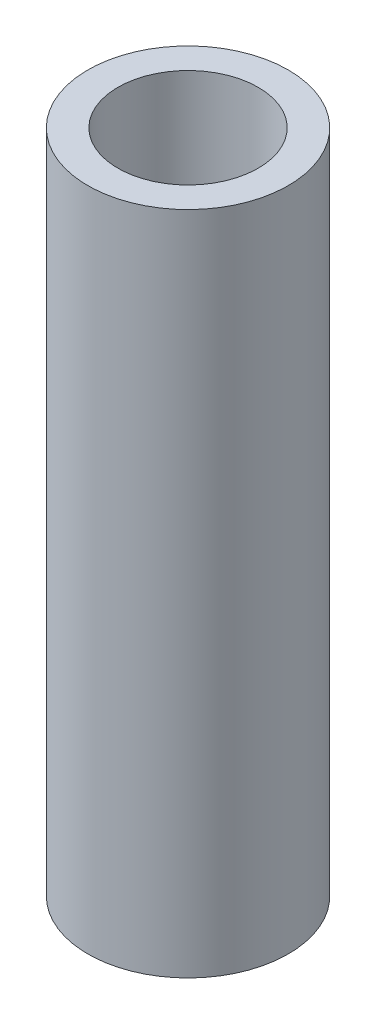
ISO-10303-21;
HEADER;
FILE_DESCRIPTION(('STEP AP214'),'2;1');
FILE_NAME('part.step','',(''),(''),'','','');
FILE_SCHEMA(('AUTOMOTIVE_DESIGN { 1 0 10303 214 1 1 1 1 }'));
ENDSEC;
DATA;
#1=APPLICATION_CONTEXT('core data for automotive mechanical design processes');
#2=APPLICATION_PROTOCOL_DEFINITION('international standard','automotive_design',2000,#1);
#3=PRODUCT_CONTEXT('',#1,'mechanical');
#4=PRODUCT('Part','Part','',(#3));
#5=PRODUCT_RELATED_PRODUCT_CATEGORY('part','',(#4));
#6=PRODUCT_DEFINITION_FORMATION('','',#4);
#7=PRODUCT_DEFINITION_CONTEXT('part definition',#1,'design');
#8=PRODUCT_DEFINITION('design','',#6,#7);
#9=PRODUCT_DEFINITION_SHAPE('','',#8);
#10=(LENGTH_UNIT() NAMED_UNIT(*) SI_UNIT(.MILLI.,.METRE.));
#11=(NAMED_UNIT(*) PLANE_ANGLE_UNIT() SI_UNIT($,.RADIAN.));
#12=(NAMED_UNIT(*) SI_UNIT($,.STERADIAN.) SOLID_ANGLE_UNIT());
#13=UNCERTAINTY_MEASURE_WITH_UNIT(LENGTH_MEASURE(1.E-05),#10,'distance_accuracy_value','');
#14=(GEOMETRIC_REPRESENTATION_CONTEXT(3) GLOBAL_UNCERTAINTY_ASSIGNED_CONTEXT((#13)) GLOBAL_UNIT_ASSIGNED_CONTEXT((#10,
#11,#12)) REPRESENTATION_CONTEXT('',''));
#15=CARTESIAN_POINT('',(0.,0.,0.));
#16=DIRECTION('',(0.,0.,1.));
#17=DIRECTION('',(1.,0.,0.));
#18=AXIS2_PLACEMENT_3D('',#15,#16,#17);
#19=CARTESIAN_POINT('',(0.,8.3,0.));
#20=DIRECTION('',(0.,1.,0.));
#21=DIRECTION('',(0.,0.,1.));
#22=AXIS2_PLACEMENT_3D('',#19,#20,#21);
#23=PLANE('',#22);
#24=CARTESIAN_POINT('',(0.,8.3,0.));
#25=DIRECTION('',(0.,1.,0.));
#26=DIRECTION('',(0.,0.,1.));
#27=AXIS2_PLACEMENT_3D('',#24,#25,#26);
#28=CIRCLE('',#27,2.5);
#29=CARTESIAN_POINT('',(0.,8.3,-2.5));
#30=VERTEX_POINT('',#29);
#31=EDGE_CURVE('E10',#30,#30,#28,.T.);
#32=ORIENTED_EDGE('',*,*,#31,.T.);
#33=EDGE_LOOP('',(#32));
#34=FACE_BOUND('',#33,.T.);
#35=CARTESIAN_POINT('',(0.,8.3,0.));
#36=DIRECTION('',(0.,1.,0.));
#37=DIRECTION('',(0.,0.,1.));
#38=AXIS2_PLACEMENT_3D('',#35,#36,#37);
#39=CIRCLE('',#38,1.75);
#40=CARTESIAN_POINT('',(0.,8.3,-1.75));
#41=VERTEX_POINT('',#40);
#42=EDGE_CURVE('E56',#41,#41,#39,.T.);
#43=ORIENTED_EDGE('',*,*,#42,.F.);
#44=EDGE_LOOP('',(#43));
#45=FACE_BOUND('',#44,.T.);
#46=ADVANCED_FACE('F45',(#34,#45),#23,.T.);
#47=CARTESIAN_POINT('',(0.,-8.3,0.));
#48=DIRECTION('',(0.,1.,0.));
#49=DIRECTION('',(0.,0.,1.));
#50=AXIS2_PLACEMENT_3D('',#47,#48,#49);
#51=PLANE('',#50);
#52=CARTESIAN_POINT('',(0.,-8.3,0.));
#53=DIRECTION('',(0.,1.,0.));
#54=DIRECTION('',(0.,0.,1.));
#55=AXIS2_PLACEMENT_3D('',#52,#53,#54);
#56=CIRCLE('',#55,2.5);
#57=CARTESIAN_POINT('',(0.,-8.3,-2.5));
#58=VERTEX_POINT('',#57);
#59=EDGE_CURVE('E49',#58,#58,#56,.T.);
#60=ORIENTED_EDGE('',*,*,#59,.F.);
#61=EDGE_LOOP('',(#60));
#62=FACE_BOUND('',#61,.T.);
#63=CARTESIAN_POINT('',(0.,-8.3,0.));
#64=DIRECTION('',(0.,1.,0.));
#65=DIRECTION('',(0.,0.,1.));
#66=AXIS2_PLACEMENT_3D('',#63,#64,#65);
#67=CIRCLE('',#66,1.75);
#68=CARTESIAN_POINT('',(0.,-8.3,-1.75));
#69=VERTEX_POINT('',#68);
#70=EDGE_CURVE('E58',#69,#69,#67,.T.);
#71=ORIENTED_EDGE('',*,*,#70,.T.);
#72=EDGE_LOOP('',(#71));
#73=FACE_BOUND('',#72,.T.);
#74=ADVANCED_FACE('F68',(#62,#73),#51,.F.);
#75=CARTESIAN_POINT('',(0.,8.3,0.));
#76=DIRECTION('',(0.,-1.,0.));
#77=DIRECTION('',(0.,0.,-1.));
#78=AXIS2_PLACEMENT_3D('',#75,#76,#77);
#79=CYLINDRICAL_SURFACE('',#78,2.5);
#80=CARTESIAN_POINT('',(0.,8.3,-2.5));
#81=CARTESIAN_POINT('',(0.,8.12708333333333,-2.5));
#82=CARTESIAN_POINT('',(0.,7.95416666666666,-2.5));
#83=CARTESIAN_POINT('',(0.,7.60833333333333,-2.5));
#84=CARTESIAN_POINT('',(0.,7.43541666666667,-2.5));
#85=CARTESIAN_POINT('',(0.,7.08958333333333,-2.5));
#86=CARTESIAN_POINT('',(0.,6.91666666666667,-2.5));
#87=CARTESIAN_POINT('',(0.,6.57083333333333,-2.5));
#88=CARTESIAN_POINT('',(0.,6.39791666666667,-2.5));
#89=CARTESIAN_POINT('',(0.,6.05208333333333,-2.5));
#90=CARTESIAN_POINT('',(0.,5.87916666666667,-2.5));
#91=CARTESIAN_POINT('',(0.,5.53333333333333,-2.5));
#92=CARTESIAN_POINT('',(0.,5.36041666666667,-2.5));
#93=CARTESIAN_POINT('',(0.,5.01458333333333,-2.5));
#94=CARTESIAN_POINT('',(0.,4.84166666666667,-2.5));
#95=CARTESIAN_POINT('',(0.,4.49583333333333,-2.5));
#96=CARTESIAN_POINT('',(0.,4.32291666666667,-2.5));
#97=CARTESIAN_POINT('',(0.,3.97708333333333,-2.5));
#98=CARTESIAN_POINT('',(0.,3.80416666666667,-2.5));
#99=CARTESIAN_POINT('',(0.,3.45833333333333,-2.5));
#100=CARTESIAN_POINT('',(0.,3.28541666666667,-2.5));
#101=CARTESIAN_POINT('',(0.,2.93958333333333,-2.5));
#102=CARTESIAN_POINT('',(0.,2.76666666666667,-2.5));
#103=CARTESIAN_POINT('',(0.,2.42083333333333,-2.5));
#104=CARTESIAN_POINT('',(0.,2.24791666666667,-2.5));
#105=CARTESIAN_POINT('',(0.,1.90208333333333,-2.5));
#106=CARTESIAN_POINT('',(0.,1.72916666666667,-2.5));
#107=CARTESIAN_POINT('',(0.,1.38333333333333,-2.5));
#108=CARTESIAN_POINT('',(0.,1.21041666666667,-2.5));
#109=CARTESIAN_POINT('',(0.,0.864583333333332,-2.5));
#110=CARTESIAN_POINT('',(0.,0.691666666666665,-2.5));
#111=CARTESIAN_POINT('',(0.,0.345833333333332,-2.5));
#112=CARTESIAN_POINT('',(0.,0.172916666666665,-2.5));
#113=CARTESIAN_POINT('',(0.,-0.172916666666668,-2.5));
#114=CARTESIAN_POINT('',(0.,-0.345833333333335,-2.5));
#115=CARTESIAN_POINT('',(0.,-0.691666666666669,-2.5));
#116=CARTESIAN_POINT('',(0.,-0.864583333333335,-2.5));
#117=CARTESIAN_POINT('',(0.,-1.21041666666667,-2.5));
#118=CARTESIAN_POINT('',(0.,-1.38333333333334,-2.5));
#119=CARTESIAN_POINT('',(0.,-1.72916666666667,-2.5));
#120=CARTESIAN_POINT('',(0.,-1.90208333333334,-2.5));
#121=CARTESIAN_POINT('',(0.,-2.24791666666667,-2.5));
#122=CARTESIAN_POINT('',(0.,-2.42083333333334,-2.5));
#123=CARTESIAN_POINT('',(0.,-2.76666666666667,-2.5));
#124=CARTESIAN_POINT('',(0.,-2.93958333333334,-2.5));
#125=CARTESIAN_POINT('',(0.,-3.28541666666667,-2.5));
#126=CARTESIAN_POINT('',(0.,-3.45833333333334,-2.5));
#127=CARTESIAN_POINT('',(0.,-3.80416666666667,-2.5));
#128=CARTESIAN_POINT('',(0.,-3.97708333333334,-2.5));
#129=CARTESIAN_POINT('',(0.,-4.32291666666667,-2.5));
#130=CARTESIAN_POINT('',(0.,-4.49583333333334,-2.5));
#131=CARTESIAN_POINT('',(0.,-4.84166666666667,-2.5));
#132=CARTESIAN_POINT('',(0.,-5.01458333333334,-2.5));
#133=CARTESIAN_POINT('',(0.,-5.36041666666667,-2.5));
#134=CARTESIAN_POINT('',(0.,-5.53333333333334,-2.5));
#135=CARTESIAN_POINT('',(0.,-5.87916666666667,-2.5));
#136=CARTESIAN_POINT('',(0.,-6.05208333333334,-2.5));
#137=CARTESIAN_POINT('',(0.,-6.39791666666667,-2.5));
#138=CARTESIAN_POINT('',(0.,-6.57083333333334,-2.5));
#139=CARTESIAN_POINT('',(0.,-6.91666666666667,-2.5));
#140=CARTESIAN_POINT('',(0.,-7.08958333333334,-2.5));
#141=CARTESIAN_POINT('',(0.,-7.43541666666667,-2.5));
#142=CARTESIAN_POINT('',(0.,-7.60833333333334,-2.5));
#143=CARTESIAN_POINT('',(0.,-7.95416666666667,-2.5));
#144=CARTESIAN_POINT('',(0.,-8.12708333333333,-2.5));
#145=CARTESIAN_POINT('',(0.,-8.3,-2.5));
#146=B_SPLINE_CURVE_WITH_KNOTS('',3,(#80,#81,#82,#83,#84,#85,#86,#87,#88,#89,#90,#91,#92,#93,
#94,#95,#96,#97,#98,#99,#100,#101,#102,#103,#104,#105,#106,#107,#108,#109,#110,#111,#112,#113,
#114,#115,#116,#117,#118,#119,#120,#121,#122,#123,#124,#125,#126,#127,#128,#129,#130,#131,#132,
#133,#134,#135,#136,#137,#138,#139,#140,#141,#142,#143,#144,#145),.UNSPECIFIED.,.F.,.F.,(4,2,2,
2,2,2,2,2,2,2,2,2,2,2,2,2,2,2,2,2,2,2,2,2,2,2,2,2,2,2,2,2,4),(0.,0.518749999999999,1.0375,
1.55625,2.075,2.59375,3.1125,3.63125,4.15,4.66875,5.1875,5.70625,6.225,6.74375,7.2625,7.78125,
8.3,8.81875,9.3375,9.85625,10.375,10.89375,11.4125,11.93125,12.45,12.96875,13.4875,14.00625,
14.525,15.04375,15.5625,16.08125,16.6),.UNSPECIFIED.);
#147=EDGE_CURVE('BSEAM47',#30,#58,#146,.T.);
#148=ORIENTED_EDGE('',*,*,#31,.F.);
#149=ORIENTED_EDGE('',*,*,#59,.T.);
#150=ORIENTED_EDGE('',*,*,#147,.T.);
#151=ORIENTED_EDGE('',*,*,#147,.F.);
#152=EDGE_LOOP('',(#148,#150,#149,#151));
#153=FACE_BOUND('',#152,.T.);
#154=ADVANCED_FACE('F47',(#153),#79,.T.);
#155=CARTESIAN_POINT('',(0.,8.3,0.));
#156=DIRECTION('',(0.,-1.,0.));
#157=DIRECTION('',(0.,0.,-1.));
#158=AXIS2_PLACEMENT_3D('',#155,#156,#157);
#159=CYLINDRICAL_SURFACE('',#158,1.75);
#160=CARTESIAN_POINT('',(0.,8.3,-1.75));
#161=CARTESIAN_POINT('',(0.,8.12708333333333,-1.75));
#162=CARTESIAN_POINT('',(0.,7.95416666666666,-1.75));
#163=CARTESIAN_POINT('',(0.,7.60833333333333,-1.75));
#164=CARTESIAN_POINT('',(0.,7.43541666666667,-1.75));
#165=CARTESIAN_POINT('',(0.,7.08958333333333,-1.75));
#166=CARTESIAN_POINT('',(0.,6.91666666666667,-1.75));
#167=CARTESIAN_POINT('',(0.,6.57083333333333,-1.75));
#168=CARTESIAN_POINT('',(0.,6.39791666666667,-1.75));
#169=CARTESIAN_POINT('',(0.,6.05208333333333,-1.75));
#170=CARTESIAN_POINT('',(0.,5.87916666666667,-1.75));
#171=CARTESIAN_POINT('',(0.,5.53333333333333,-1.75));
#172=CARTESIAN_POINT('',(0.,5.36041666666667,-1.75));
#173=CARTESIAN_POINT('',(0.,5.01458333333333,-1.75));
#174=CARTESIAN_POINT('',(0.,4.84166666666667,-1.75));
#175=CARTESIAN_POINT('',(0.,4.49583333333333,-1.75));
#176=CARTESIAN_POINT('',(0.,4.32291666666667,-1.75));
#177=CARTESIAN_POINT('',(0.,3.97708333333333,-1.75));
#178=CARTESIAN_POINT('',(0.,3.80416666666667,-1.75));
#179=CARTESIAN_POINT('',(0.,3.45833333333333,-1.75));
#180=CARTESIAN_POINT('',(0.,3.28541666666667,-1.75));
#181=CARTESIAN_POINT('',(0.,2.93958333333333,-1.75));
#182=CARTESIAN_POINT('',(0.,2.76666666666667,-1.75));
#183=CARTESIAN_POINT('',(0.,2.42083333333333,-1.75));
#184=CARTESIAN_POINT('',(0.,2.24791666666667,-1.75));
#185=CARTESIAN_POINT('',(0.,1.90208333333333,-1.75));
#186=CARTESIAN_POINT('',(0.,1.72916666666667,-1.75));
#187=CARTESIAN_POINT('',(0.,1.38333333333333,-1.75));
#188=CARTESIAN_POINT('',(0.,1.21041666666667,-1.75));
#189=CARTESIAN_POINT('',(0.,0.864583333333332,-1.75));
#190=CARTESIAN_POINT('',(0.,0.691666666666665,-1.75));
#191=CARTESIAN_POINT('',(0.,0.345833333333332,-1.75));
#192=CARTESIAN_POINT('',(0.,0.172916666666665,-1.75));
#193=CARTESIAN_POINT('',(0.,-0.172916666666668,-1.75));
#194=CARTESIAN_POINT('',(0.,-0.345833333333335,-1.75));
#195=CARTESIAN_POINT('',(0.,-0.691666666666669,-1.75));
#196=CARTESIAN_POINT('',(0.,-0.864583333333335,-1.75));
#197=CARTESIAN_POINT('',(0.,-1.21041666666667,-1.75));
#198=CARTESIAN_POINT('',(0.,-1.38333333333334,-1.75));
#199=CARTESIAN_POINT('',(0.,-1.72916666666667,-1.75));
#200=CARTESIAN_POINT('',(0.,-1.90208333333334,-1.75));
#201=CARTESIAN_POINT('',(0.,-2.24791666666667,-1.75));
#202=CARTESIAN_POINT('',(0.,-2.42083333333334,-1.75));
#203=CARTESIAN_POINT('',(0.,-2.76666666666667,-1.75));
#204=CARTESIAN_POINT('',(0.,-2.93958333333334,-1.75));
#205=CARTESIAN_POINT('',(0.,-3.28541666666667,-1.75));
#206=CARTESIAN_POINT('',(0.,-3.45833333333334,-1.75));
#207=CARTESIAN_POINT('',(0.,-3.80416666666667,-1.75));
#208=CARTESIAN_POINT('',(0.,-3.97708333333334,-1.75));
#209=CARTESIAN_POINT('',(0.,-4.32291666666667,-1.75));
#210=CARTESIAN_POINT('',(0.,-4.49583333333334,-1.75));
#211=CARTESIAN_POINT('',(0.,-4.84166666666667,-1.75));
#212=CARTESIAN_POINT('',(0.,-5.01458333333334,-1.75));
#213=CARTESIAN_POINT('',(0.,-5.36041666666667,-1.75));
#214=CARTESIAN_POINT('',(0.,-5.53333333333334,-1.75));
#215=CARTESIAN_POINT('',(0.,-5.87916666666667,-1.75));
#216=CARTESIAN_POINT('',(0.,-6.05208333333334,-1.75));
#217=CARTESIAN_POINT('',(0.,-6.39791666666667,-1.75));
#218=CARTESIAN_POINT('',(0.,-6.57083333333334,-1.75));
#219=CARTESIAN_POINT('',(0.,-6.91666666666667,-1.75));
#220=CARTESIAN_POINT('',(0.,-7.08958333333334,-1.75));
#221=CARTESIAN_POINT('',(0.,-7.43541666666667,-1.75));
#222=CARTESIAN_POINT('',(0.,-7.60833333333334,-1.75));
#223=CARTESIAN_POINT('',(0.,-7.95416666666667,-1.75));
#224=CARTESIAN_POINT('',(0.,-8.12708333333333,-1.75));
#225=CARTESIAN_POINT('',(0.,-8.3,-1.75));
#226=B_SPLINE_CURVE_WITH_KNOTS('',3,(#160,#161,#162,#163,#164,#165,#166,#167,#168,#169,#170,
#171,#172,#173,#174,#175,#176,#177,#178,#179,#180,#181,#182,#183,#184,#185,#186,#187,#188,#189,
#190,#191,#192,#193,#194,#195,#196,#197,#198,#199,#200,#201,#202,#203,#204,#205,#206,#207,#208,
#209,#210,#211,#212,#213,#214,#215,#216,#217,#218,#219,#220,#221,#222,#223,#224,#225),
.UNSPECIFIED.,.F.,.F.,(4,2,2,2,2,2,2,2,2,2,2,2,2,2,2,2,2,2,2,2,2,2,2,2,2,2,2,2,2,2,2,2,4),(0.,
0.518749999999999,1.0375,1.55625,2.075,2.59375,3.1125,3.63125,4.15,4.66875,5.1875,5.70625,6.225,
6.74375,7.2625,7.78125,8.3,8.81875,9.3375,9.85625,10.375,10.89375,11.4125,11.93125,12.45,
12.96875,13.4875,14.00625,14.525,15.04375,15.5625,16.08125,16.6),.UNSPECIFIED.);
#227=EDGE_CURVE('BSEAM64',#41,#69,#226,.T.);
#228=ORIENTED_EDGE('',*,*,#42,.T.);
#229=ORIENTED_EDGE('',*,*,#70,.F.);
#230=ORIENTED_EDGE('',*,*,#227,.T.);
#231=ORIENTED_EDGE('',*,*,#227,.F.);
#232=EDGE_LOOP('',(#228,#230,#229,#231));
#233=FACE_BOUND('',#232,.T.);
#234=ADVANCED_FACE('F64',(#233),#159,.F.);
#235=CLOSED_SHELL('',(#46,#74,#154,#234));
#236=MANIFOLD_SOLID_BREP('B2',#235);
#237=ADVANCED_BREP_SHAPE_REPRESENTATION('',(#18,#236),#14);
#238=SHAPE_DEFINITION_REPRESENTATION(#9,#237);
ENDSEC;
END-ISO-10303-21;
